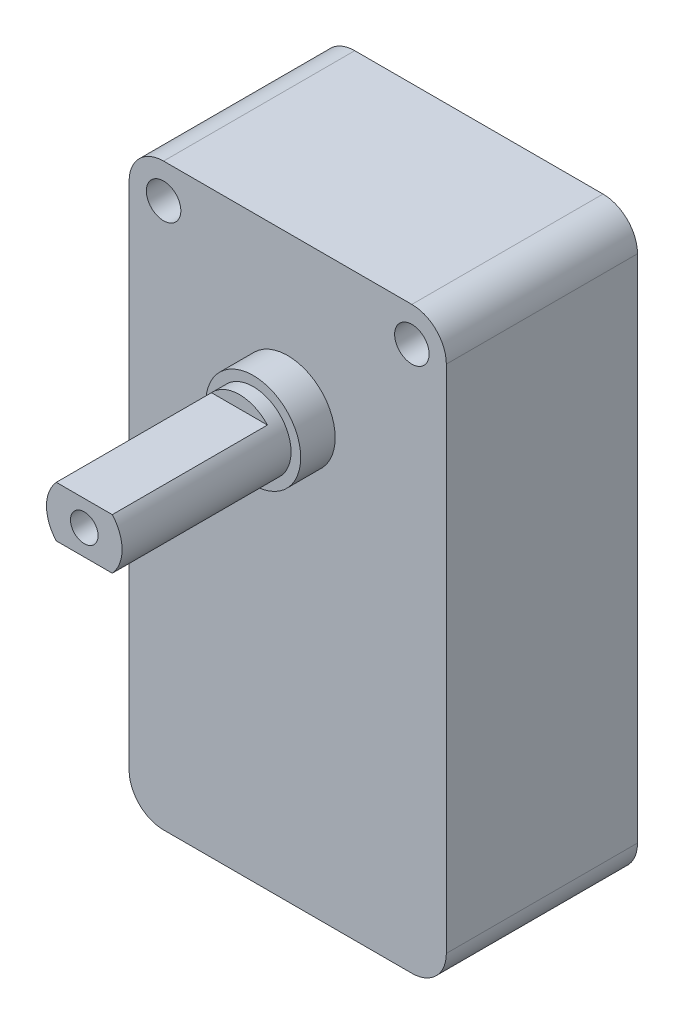
ISO-10303-21;
HEADER;
FILE_DESCRIPTION(('STEP AP214'),'2;1');
FILE_NAME('part.step','',(''),(''),'','','');
FILE_SCHEMA(('AUTOMOTIVE_DESIGN { 1 0 10303 214 1 1 1 1 }'));
ENDSEC;
DATA;
#1=APPLICATION_CONTEXT('core data for automotive mechanical design processes');
#2=APPLICATION_PROTOCOL_DEFINITION('international standard','automotive_design',2000,#1);
#3=PRODUCT_CONTEXT('',#1,'mechanical');
#4=PRODUCT('Part','Part','',(#3));
#5=PRODUCT_RELATED_PRODUCT_CATEGORY('part','',(#4));
#6=PRODUCT_DEFINITION_FORMATION('','',#4);
#7=PRODUCT_DEFINITION_CONTEXT('part definition',#1,'design');
#8=PRODUCT_DEFINITION('design','',#6,#7);
#9=PRODUCT_DEFINITION_SHAPE('','',#8);
#10=(LENGTH_UNIT() NAMED_UNIT(*) SI_UNIT(.MILLI.,.METRE.));
#11=(NAMED_UNIT(*) PLANE_ANGLE_UNIT() SI_UNIT($,.RADIAN.));
#12=(NAMED_UNIT(*) SI_UNIT($,.STERADIAN.) SOLID_ANGLE_UNIT());
#13=UNCERTAINTY_MEASURE_WITH_UNIT(LENGTH_MEASURE(1.E-05),#10,'distance_accuracy_value','');
#14=(GEOMETRIC_REPRESENTATION_CONTEXT(3) GLOBAL_UNCERTAINTY_ASSIGNED_CONTEXT((#13)) GLOBAL_UNIT_ASSIGNED_CONTEXT((#10,
#11,#12)) REPRESENTATION_CONTEXT('',''));
#15=CARTESIAN_POINT('',(0.,0.,0.));
#16=DIRECTION('',(0.,0.,1.));
#17=DIRECTION('',(1.,0.,0.));
#18=AXIS2_PLACEMENT_3D('',#15,#16,#17);
#19=CARTESIAN_POINT('',(0.,0.,3.5));
#20=DIRECTION('',(0.,0.,1.));
#21=DIRECTION('',(1.,0.,0.));
#22=AXIS2_PLACEMENT_3D('',#19,#20,#21);
#23=PLANE('',#22);
#24=CARTESIAN_POINT('',(0.,0.,3.5));
#25=DIRECTION('',(0.,0.,1.));
#26=DIRECTION('',(1.,0.,0.));
#27=AXIS2_PLACEMENT_3D('',#24,#25,#26);
#28=CIRCLE('',#27,2.74);
#29=CARTESIAN_POINT('',(2.03027091788265,1.84,3.5));
#30=VERTEX_POINT('',#29);
#31=CARTESIAN_POINT('',(-2.03027091788264,1.84,3.5));
#32=VERTEX_POINT('',#31);
#33=EDGE_CURVE('E173',#30,#32,#28,.T.);
#34=ORIENTED_EDGE('',*,*,#33,.T.);
#35=DIRECTION('',(1.,0.,0.));
#36=VECTOR('',#35,1.);
#37=CARTESIAN_POINT('',(0.,1.84,3.5));
#38=LINE('',#37,#36);
#39=EDGE_CURVE('E12',#32,#30,#38,.T.);
#40=ORIENTED_EDGE('',*,*,#39,.T.);
#41=EDGE_LOOP('',(#34,#40));
#42=FACE_BOUND('',#41,.T.);
#43=ADVANCED_FACE('F64',(#42),#23,.T.);
#44=CARTESIAN_POINT('',(-2.03027091788264,-1.84,3.5));
#45=VERTEX_POINT('',#44);
#46=CARTESIAN_POINT('',(2.03027091788264,-1.83999999999999,3.5));
#47=VERTEX_POINT('',#46);
#48=EDGE_CURVE('E78',#45,#47,#28,.T.);
#49=ORIENTED_EDGE('',*,*,#48,.T.);
#50=DIRECTION('',(-1.,0.,0.));
#51=VECTOR('',#50,1.);
#52=CARTESIAN_POINT('',(0.,-1.84,3.5));
#53=LINE('',#52,#51);
#54=EDGE_CURVE('E72',#47,#45,#53,.T.);
#55=ORIENTED_EDGE('',*,*,#54,.T.);
#56=EDGE_LOOP('',(#49,#55));
#57=FACE_BOUND('',#56,.T.);
#58=ADVANCED_FACE('F273',(#57),#23,.T.);
#59=CARTESIAN_POINT('',(0.,0.,2.5));
#60=DIRECTION('',(0.,0.,1.));
#61=DIRECTION('',(1.,0.,0.));
#62=AXIS2_PLACEMENT_3D('',#59,#60,#61);
#63=PLANE('',#62);
#64=CARTESIAN_POINT('',(0.,0.,2.5));
#65=DIRECTION('',(0.,0.,1.));
#66=DIRECTION('',(1.,0.,0.));
#67=AXIS2_PLACEMENT_3D('',#64,#65,#66);
#68=CIRCLE('',#67,3.44);
#69=CARTESIAN_POINT('',(3.44,0.,2.5));
#70=VERTEX_POINT('',#69);
#71=EDGE_CURVE('E180',#70,#70,#68,.T.);
#72=ORIENTED_EDGE('',*,*,#71,.T.);
#73=EDGE_LOOP('',(#72));
#74=FACE_BOUND('',#73,.T.);
#75=CARTESIAN_POINT('',(0.,0.,2.5));
#76=DIRECTION('',(0.,0.,1.));
#77=DIRECTION('',(1.,0.,0.));
#78=AXIS2_PLACEMENT_3D('',#75,#76,#77);
#79=CIRCLE('',#78,2.74);
#80=CARTESIAN_POINT('',(2.74,0.,2.5));
#81=VERTEX_POINT('',#80);
#82=EDGE_CURVE('E179',#81,#81,#79,.F.);
#83=ORIENTED_EDGE('',*,*,#82,.T.);
#84=EDGE_LOOP('',(#83));
#85=FACE_BOUND('',#84,.T.);
#86=ADVANCED_FACE('F284',(#74,#85),#63,.T.);
#87=CARTESIAN_POINT('',(0.,0.,0.));
#88=DIRECTION('',(0.,0.,1.));
#89=DIRECTION('',(1.,0.,0.));
#90=AXIS2_PLACEMENT_3D('',#87,#88,#89);
#91=PLANE('',#90);
#92=DIRECTION('',(1.,0.,0.));
#93=VECTOR('',#92,1.);
#94=CARTESIAN_POINT('',(0.,11.15,0.));
#95=LINE('',#94,#93);
#96=CARTESIAN_POINT('',(-8.99999999999998,11.15,0.));
#97=VERTEX_POINT('',#96);
#98=CARTESIAN_POINT('',(8.99999999999999,11.15,0.));
#99=VERTEX_POINT('',#98);
#100=EDGE_CURVE('E222',#97,#99,#95,.T.);
#101=ORIENTED_EDGE('',*,*,#100,.F.);
#102=CARTESIAN_POINT('',(-8.99999999999999,8.65,0.));
#103=DIRECTION('',(0.,0.,1.));
#104=DIRECTION('',(1.,0.,0.));
#105=AXIS2_PLACEMENT_3D('',#102,#103,#104);
#106=CIRCLE('',#105,2.5);
#107=CARTESIAN_POINT('',(-11.5,8.64999999999998,0.));
#108=VERTEX_POINT('',#107);
#109=EDGE_CURVE('E225',#97,#108,#106,.T.);
#110=ORIENTED_EDGE('',*,*,#109,.T.);
#111=DIRECTION('',(0.,-1.,0.));
#112=VECTOR('',#111,1.);
#113=CARTESIAN_POINT('',(-11.5,0.,0.));
#114=LINE('',#113,#112);
#115=CARTESIAN_POINT('',(-11.5,-28.35,0.));
#116=VERTEX_POINT('',#115);
#117=EDGE_CURVE('E228',#108,#116,#114,.T.);
#118=ORIENTED_EDGE('',*,*,#117,.T.);
#119=CARTESIAN_POINT('',(-8.99999999999999,-28.35,0.));
#120=DIRECTION('',(0.,0.,1.));
#121=DIRECTION('',(1.,0.,0.));
#122=AXIS2_PLACEMENT_3D('',#119,#120,#121);
#123=CIRCLE('',#122,2.5);
#124=CARTESIAN_POINT('',(-8.99999999999997,-30.85,0.));
#125=VERTEX_POINT('',#124);
#126=EDGE_CURVE('E231',#116,#125,#123,.T.);
#127=ORIENTED_EDGE('',*,*,#126,.T.);
#128=DIRECTION('',(1.,0.,0.));
#129=VECTOR('',#128,1.);
#130=CARTESIAN_POINT('',(0.,-30.85,0.));
#131=LINE('',#130,#129);
#132=CARTESIAN_POINT('',(8.99999999999999,-30.85,0.));
#133=VERTEX_POINT('',#132);
#134=EDGE_CURVE('E234',#125,#133,#131,.T.);
#135=ORIENTED_EDGE('',*,*,#134,.T.);
#136=CARTESIAN_POINT('',(9.00000000000001,-28.35,0.));
#137=DIRECTION('',(0.,0.,1.));
#138=DIRECTION('',(1.,0.,0.));
#139=AXIS2_PLACEMENT_3D('',#136,#137,#138);
#140=CIRCLE('',#139,2.5);
#141=CARTESIAN_POINT('',(11.5,-28.35,0.));
#142=VERTEX_POINT('',#141);
#143=EDGE_CURVE('E237',#133,#142,#140,.T.);
#144=ORIENTED_EDGE('',*,*,#143,.T.);
#145=DIRECTION('',(0.,-1.,0.));
#146=VECTOR('',#145,1.);
#147=CARTESIAN_POINT('',(11.5,0.,0.));
#148=LINE('',#147,#146);
#149=CARTESIAN_POINT('',(11.5,8.64999999999999,0.));
#150=VERTEX_POINT('',#149);
#151=EDGE_CURVE('E240',#150,#142,#148,.T.);
#152=ORIENTED_EDGE('',*,*,#151,.F.);
#153=CARTESIAN_POINT('',(9.00000000000001,8.65,0.));
#154=DIRECTION('',(0.,0.,1.));
#155=DIRECTION('',(1.,0.,0.));
#156=AXIS2_PLACEMENT_3D('',#153,#154,#155);
#157=CIRCLE('',#156,2.5);
#158=EDGE_CURVE('E191',#99,#150,#157,.F.);
#159=ORIENTED_EDGE('',*,*,#158,.F.);
#160=EDGE_LOOP('',(#101,#110,#118,#127,#135,#144,#152,#159));
#161=FACE_BOUND('',#160,.T.);
#162=CARTESIAN_POINT('',(-8.99999999999999,8.65,0.));
#163=DIRECTION('',(0.,0.,1.));
#164=DIRECTION('',(1.,0.,0.));
#165=AXIS2_PLACEMENT_3D('',#162,#163,#164);
#166=CIRCLE('',#165,1.25);
#167=CARTESIAN_POINT('',(-7.74999999999999,8.65,0.));
#168=VERTEX_POINT('',#167);
#169=EDGE_CURVE('E219',#168,#168,#166,.T.);
#170=ORIENTED_EDGE('',*,*,#169,.F.);
#171=EDGE_LOOP('',(#170));
#172=FACE_BOUND('',#171,.T.);
#173=CARTESIAN_POINT('',(9.00000000000001,8.65,0.));
#174=DIRECTION('',(0.,0.,1.));
#175=DIRECTION('',(1.,0.,0.));
#176=AXIS2_PLACEMENT_3D('',#173,#174,#175);
#177=CIRCLE('',#176,1.25);
#178=CARTESIAN_POINT('',(10.25,8.65,0.));
#179=VERTEX_POINT('',#178);
#180=EDGE_CURVE('E183',#179,#179,#177,.T.);
#181=ORIENTED_EDGE('',*,*,#180,.F.);
#182=EDGE_LOOP('',(#181));
#183=FACE_BOUND('',#182,.T.);
#184=CARTESIAN_POINT('',(0.,0.,0.));
#185=DIRECTION('',(0.,0.,1.));
#186=DIRECTION('',(1.,0.,0.));
#187=AXIS2_PLACEMENT_3D('',#184,#185,#186);
#188=CIRCLE('',#187,3.44);
#189=CARTESIAN_POINT('',(3.44,0.,0.));
#190=VERTEX_POINT('',#189);
#191=EDGE_CURVE('E184',#190,#190,#188,.T.);
#192=ORIENTED_EDGE('',*,*,#191,.F.);
#193=EDGE_LOOP('',(#192));
#194=FACE_BOUND('',#193,.T.);
#195=ADVANCED_FACE('F288',(#161,#172,#183,#194),#91,.T.);
#196=CARTESIAN_POINT('',(0.,11.15,-13.86));
#197=DIRECTION('',(0.,-1.,0.));
#198=DIRECTION('',(1.,0.,0.));
#199=AXIS2_PLACEMENT_3D('',#196,#197,#198);
#200=PLANE('',#199);
#201=ORIENTED_EDGE('',*,*,#100,.T.);
#202=DIRECTION('',(0.,0.,1.));
#203=VECTOR('',#202,1.);
#204=CARTESIAN_POINT('',(8.99999999999999,11.15,-13.86));
#205=LINE('',#204,#203);
#206=CARTESIAN_POINT('',(8.99999999999999,11.15,-13.86));
#207=VERTEX_POINT('',#206);
#208=EDGE_CURVE('E244',#207,#99,#205,.T.);
#209=ORIENTED_EDGE('',*,*,#208,.F.);
#210=DIRECTION('',(1.,0.,0.));
#211=VECTOR('',#210,1.);
#212=CARTESIAN_POINT('',(0.,11.15,-13.86));
#213=LINE('',#212,#211);
#214=CARTESIAN_POINT('',(-8.99999999999998,11.15,-13.86));
#215=VERTEX_POINT('',#214);
#216=EDGE_CURVE('E194',#215,#207,#213,.T.);
#217=ORIENTED_EDGE('',*,*,#216,.F.);
#218=DIRECTION('',(0.,0.,1.));
#219=VECTOR('',#218,1.);
#220=CARTESIAN_POINT('',(-8.99999999999998,11.15,-13.86));
#221=LINE('',#220,#219);
#222=EDGE_CURVE('E216',#215,#97,#221,.T.);
#223=ORIENTED_EDGE('',*,*,#222,.T.);
#224=EDGE_LOOP('',(#201,#209,#217,#223));
#225=FACE_BOUND('',#224,.T.);
#226=ADVANCED_FACE('F294',(#225),#200,.F.);
#227=CARTESIAN_POINT('',(9.00000000000001,8.65,-13.86));
#228=DIRECTION('',(0.,0.,1.));
#229=DIRECTION('',(1.,0.,0.));
#230=AXIS2_PLACEMENT_3D('',#227,#228,#229);
#231=CYLINDRICAL_SURFACE('',#230,2.5);
#232=ORIENTED_EDGE('',*,*,#158,.T.);
#233=DIRECTION('',(0.,0.,1.));
#234=VECTOR('',#233,1.);
#235=CARTESIAN_POINT('',(11.5,8.64999999999999,-13.86));
#236=LINE('',#235,#234);
#237=CARTESIAN_POINT('',(11.5,8.64999999999999,-13.86));
#238=VERTEX_POINT('',#237);
#239=EDGE_CURVE('E248',#238,#150,#236,.T.);
#240=ORIENTED_EDGE('',*,*,#239,.F.);
#241=CARTESIAN_POINT('',(9.00000000000001,8.65,-13.86));
#242=DIRECTION('',(0.,0.,1.));
#243=DIRECTION('',(1.,0.,0.));
#244=AXIS2_PLACEMENT_3D('',#241,#242,#243);
#245=CIRCLE('',#244,2.5);
#246=EDGE_CURVE('E214',#207,#238,#245,.F.);
#247=ORIENTED_EDGE('',*,*,#246,.F.);
#248=ORIENTED_EDGE('',*,*,#208,.T.);
#249=EDGE_LOOP('',(#232,#240,#247,#248));
#250=FACE_BOUND('',#249,.T.);
#251=ADVANCED_FACE('F308',(#250),#231,.T.);
#252=CARTESIAN_POINT('',(11.5,0.,-13.86));
#253=DIRECTION('',(-1.,0.,0.));
#254=DIRECTION('',(0.,-1.,0.));
#255=AXIS2_PLACEMENT_3D('',#252,#253,#254);
#256=PLANE('',#255);
#257=ORIENTED_EDGE('',*,*,#151,.T.);
#258=DIRECTION('',(0.,0.,1.));
#259=VECTOR('',#258,1.);
#260=CARTESIAN_POINT('',(11.5,-28.35,-13.86));
#261=LINE('',#260,#259);
#262=CARTESIAN_POINT('',(11.5,-28.35,-13.86));
#263=VERTEX_POINT('',#262);
#264=EDGE_CURVE('E251',#263,#142,#261,.T.);
#265=ORIENTED_EDGE('',*,*,#264,.F.);
#266=DIRECTION('',(0.,-1.,0.));
#267=VECTOR('',#266,1.);
#268=CARTESIAN_POINT('',(11.5,0.,-13.86));
#269=LINE('',#268,#267);
#270=EDGE_CURVE('E212',#238,#263,#269,.T.);
#271=ORIENTED_EDGE('',*,*,#270,.F.);
#272=ORIENTED_EDGE('',*,*,#239,.T.);
#273=EDGE_LOOP('',(#257,#265,#271,#272));
#274=FACE_BOUND('',#273,.T.);
#275=ADVANCED_FACE('F311',(#274),#256,.F.);
#276=CARTESIAN_POINT('',(9.00000000000001,-28.35,-13.86));
#277=DIRECTION('',(0.,0.,1.));
#278=DIRECTION('',(1.,0.,0.));
#279=AXIS2_PLACEMENT_3D('',#276,#277,#278);
#280=CYLINDRICAL_SURFACE('',#279,2.5);
#281=ORIENTED_EDGE('',*,*,#143,.F.);
#282=DIRECTION('',(0.,0.,1.));
#283=VECTOR('',#282,1.);
#284=CARTESIAN_POINT('',(8.99999999999999,-30.85,-13.86));
#285=LINE('',#284,#283);
#286=CARTESIAN_POINT('',(8.99999999999999,-30.85,-13.86));
#287=VERTEX_POINT('',#286);
#288=EDGE_CURVE('E253',#287,#133,#285,.T.);
#289=ORIENTED_EDGE('',*,*,#288,.F.);
#290=CARTESIAN_POINT('',(9.00000000000001,-28.35,-13.86));
#291=DIRECTION('',(0.,0.,1.));
#292=DIRECTION('',(1.,0.,0.));
#293=AXIS2_PLACEMENT_3D('',#290,#291,#292);
#294=CIRCLE('',#293,2.5);
#295=EDGE_CURVE('E209',#287,#263,#294,.T.);
#296=ORIENTED_EDGE('',*,*,#295,.T.);
#297=ORIENTED_EDGE('',*,*,#264,.T.);
#298=EDGE_LOOP('',(#281,#289,#296,#297));
#299=FACE_BOUND('',#298,.T.);
#300=ADVANCED_FACE('F315',(#299),#280,.T.);
#301=CARTESIAN_POINT('',(0.,-30.85,-13.86));
#302=DIRECTION('',(0.,-1.,0.));
#303=DIRECTION('',(1.,0.,0.));
#304=AXIS2_PLACEMENT_3D('',#301,#302,#303);
#305=PLANE('',#304);
#306=ORIENTED_EDGE('',*,*,#134,.F.);
#307=DIRECTION('',(0.,0.,1.));
#308=VECTOR('',#307,1.);
#309=CARTESIAN_POINT('',(-8.99999999999997,-30.85,-13.86));
#310=LINE('',#309,#308);
#311=CARTESIAN_POINT('',(-8.99999999999997,-30.85,-13.86));
#312=VERTEX_POINT('',#311);
#313=EDGE_CURVE('E255',#312,#125,#310,.T.);
#314=ORIENTED_EDGE('',*,*,#313,.F.);
#315=DIRECTION('',(1.,0.,0.));
#316=VECTOR('',#315,1.);
#317=CARTESIAN_POINT('',(0.,-30.85,-13.86));
#318=LINE('',#317,#316);
#319=EDGE_CURVE('E206',#312,#287,#318,.T.);
#320=ORIENTED_EDGE('',*,*,#319,.T.);
#321=ORIENTED_EDGE('',*,*,#288,.T.);
#322=EDGE_LOOP('',(#306,#314,#320,#321));
#323=FACE_BOUND('',#322,.T.);
#324=ADVANCED_FACE('F319',(#323),#305,.T.);
#325=CARTESIAN_POINT('',(-8.99999999999999,-28.35,-13.86));
#326=DIRECTION('',(0.,0.,1.));
#327=DIRECTION('',(1.,0.,0.));
#328=AXIS2_PLACEMENT_3D('',#325,#326,#327);
#329=CYLINDRICAL_SURFACE('',#328,2.5);
#330=ORIENTED_EDGE('',*,*,#126,.F.);
#331=DIRECTION('',(0.,0.,1.));
#332=VECTOR('',#331,1.);
#333=CARTESIAN_POINT('',(-11.5,-28.35,-13.86));
#334=LINE('',#333,#332);
#335=CARTESIAN_POINT('',(-11.5,-28.35,-13.86));
#336=VERTEX_POINT('',#335);
#337=EDGE_CURVE('E257',#336,#116,#334,.T.);
#338=ORIENTED_EDGE('',*,*,#337,.F.);
#339=CARTESIAN_POINT('',(-8.99999999999999,-28.35,-13.86));
#340=DIRECTION('',(0.,0.,1.));
#341=DIRECTION('',(1.,0.,0.));
#342=AXIS2_PLACEMENT_3D('',#339,#340,#341);
#343=CIRCLE('',#342,2.5);
#344=EDGE_CURVE('E203',#336,#312,#343,.T.);
#345=ORIENTED_EDGE('',*,*,#344,.T.);
#346=ORIENTED_EDGE('',*,*,#313,.T.);
#347=EDGE_LOOP('',(#330,#338,#345,#346));
#348=FACE_BOUND('',#347,.T.);
#349=ADVANCED_FACE('F323',(#348),#329,.T.);
#350=CARTESIAN_POINT('',(-11.5,0.,-13.86));
#351=DIRECTION('',(-1.,0.,0.));
#352=DIRECTION('',(0.,-1.,0.));
#353=AXIS2_PLACEMENT_3D('',#350,#351,#352);
#354=PLANE('',#353);
#355=ORIENTED_EDGE('',*,*,#117,.F.);
#356=DIRECTION('',(0.,0.,1.));
#357=VECTOR('',#356,1.);
#358=CARTESIAN_POINT('',(-11.5,8.64999999999998,-13.86));
#359=LINE('',#358,#357);
#360=CARTESIAN_POINT('',(-11.5,8.64999999999998,-13.86));
#361=VERTEX_POINT('',#360);
#362=EDGE_CURVE('E259',#361,#108,#359,.T.);
#363=ORIENTED_EDGE('',*,*,#362,.F.);
#364=DIRECTION('',(0.,-1.,0.));
#365=VECTOR('',#364,1.);
#366=CARTESIAN_POINT('',(-11.5,0.,-13.86));
#367=LINE('',#366,#365);
#368=EDGE_CURVE('E200',#361,#336,#367,.T.);
#369=ORIENTED_EDGE('',*,*,#368,.T.);
#370=ORIENTED_EDGE('',*,*,#337,.T.);
#371=EDGE_LOOP('',(#355,#363,#369,#370));
#372=FACE_BOUND('',#371,.T.);
#373=ADVANCED_FACE('F327',(#372),#354,.T.);
#374=CARTESIAN_POINT('',(-8.99999999999999,8.65,-13.86));
#375=DIRECTION('',(0.,0.,1.));
#376=DIRECTION('',(1.,0.,0.));
#377=AXIS2_PLACEMENT_3D('',#374,#375,#376);
#378=CYLINDRICAL_SURFACE('',#377,1.25);
#379=CARTESIAN_POINT('',(-8.99999999999999,8.65,-13.86));
#380=DIRECTION('',(0.,0.,1.));
#381=DIRECTION('',(1.,0.,0.));
#382=AXIS2_PLACEMENT_3D('',#379,#380,#381);
#383=CIRCLE('',#382,1.25);
#384=CARTESIAN_POINT('',(-7.74999999999999,8.65,-13.86));
#385=VERTEX_POINT('',#384);
#386=EDGE_CURVE('E190',#385,#385,#383,.T.);
#387=CARTESIAN_POINT('',(-7.74999999999999,8.65,-13.86));
#388=CARTESIAN_POINT('',(-7.74999999999999,8.65,-13.715625));
#389=CARTESIAN_POINT('',(-7.74999999999999,8.65,-13.57125));
#390=CARTESIAN_POINT('',(-7.74999999999999,8.65,-13.2825));
#391=CARTESIAN_POINT('',(-7.74999999999999,8.65,-13.138125));
#392=CARTESIAN_POINT('',(-7.74999999999999,8.65,-12.849375));
#393=CARTESIAN_POINT('',(-7.74999999999999,8.65,-12.705));
#394=CARTESIAN_POINT('',(-7.74999999999999,8.65,-12.41625));
#395=CARTESIAN_POINT('',(-7.74999999999999,8.65,-12.271875));
#396=CARTESIAN_POINT('',(-7.74999999999999,8.65,-11.983125));
#397=CARTESIAN_POINT('',(-7.74999999999999,8.65,-11.83875));
#398=CARTESIAN_POINT('',(-7.74999999999999,8.65,-11.55));
#399=CARTESIAN_POINT('',(-7.74999999999999,8.65,-11.405625));
#400=CARTESIAN_POINT('',(-7.74999999999999,8.65,-11.116875));
#401=CARTESIAN_POINT('',(-7.74999999999999,8.65,-10.9725));
#402=CARTESIAN_POINT('',(-7.74999999999999,8.65,-10.68375));
#403=CARTESIAN_POINT('',(-7.74999999999999,8.65,-10.539375));
#404=CARTESIAN_POINT('',(-7.74999999999999,8.65,-10.250625));
#405=CARTESIAN_POINT('',(-7.74999999999999,8.65,-10.10625));
#406=CARTESIAN_POINT('',(-7.74999999999999,8.65,-9.8175));
#407=CARTESIAN_POINT('',(-7.74999999999999,8.65,-9.673125));
#408=CARTESIAN_POINT('',(-7.74999999999999,8.65,-9.384375));
#409=CARTESIAN_POINT('',(-7.74999999999999,8.65,-9.24));
#410=CARTESIAN_POINT('',(-7.74999999999999,8.65,-8.95125));
#411=CARTESIAN_POINT('',(-7.74999999999999,8.65,-8.806875));
#412=CARTESIAN_POINT('',(-7.74999999999999,8.65,-8.518125));
#413=CARTESIAN_POINT('',(-7.74999999999999,8.65,-8.37375));
#414=CARTESIAN_POINT('',(-7.74999999999999,8.65,-8.085));
#415=CARTESIAN_POINT('',(-7.74999999999999,8.65,-7.940625));
#416=CARTESIAN_POINT('',(-7.74999999999999,8.65,-7.651875));
#417=CARTESIAN_POINT('',(-7.74999999999999,8.65,-7.5075));
#418=CARTESIAN_POINT('',(-7.74999999999999,8.65,-7.21875));
#419=CARTESIAN_POINT('',(-7.74999999999999,8.65,-7.074375));
#420=CARTESIAN_POINT('',(-7.74999999999999,8.65,-6.785625));
#421=CARTESIAN_POINT('',(-7.74999999999999,8.65,-6.64125));
#422=CARTESIAN_POINT('',(-7.74999999999999,8.65,-6.3525));
#423=CARTESIAN_POINT('',(-7.74999999999999,8.65,-6.208125));
#424=CARTESIAN_POINT('',(-7.74999999999999,8.65,-5.919375));
#425=CARTESIAN_POINT('',(-7.74999999999999,8.65,-5.775));
#426=CARTESIAN_POINT('',(-7.74999999999999,8.65,-5.48625));
#427=CARTESIAN_POINT('',(-7.74999999999999,8.65,-5.341875));
#428=CARTESIAN_POINT('',(-7.74999999999999,8.65,-5.053125));
#429=CARTESIAN_POINT('',(-7.74999999999999,8.65,-4.90875));
#430=CARTESIAN_POINT('',(-7.74999999999999,8.65,-4.62));
#431=CARTESIAN_POINT('',(-7.74999999999999,8.65,-4.475625));
#432=CARTESIAN_POINT('',(-7.74999999999999,8.65,-4.186875));
#433=CARTESIAN_POINT('',(-7.74999999999999,8.65,-4.0425));
#434=CARTESIAN_POINT('',(-7.74999999999999,8.65,-3.75375));
#435=CARTESIAN_POINT('',(-7.74999999999999,8.65,-3.609375));
#436=CARTESIAN_POINT('',(-7.74999999999999,8.65,-3.320625));
#437=CARTESIAN_POINT('',(-7.74999999999999,8.65,-3.17625));
#438=CARTESIAN_POINT('',(-7.74999999999999,8.65,-2.8875));
#439=CARTESIAN_POINT('',(-7.74999999999999,8.65,-2.743125));
#440=CARTESIAN_POINT('',(-7.74999999999999,8.65,-2.454375));
#441=CARTESIAN_POINT('',(-7.74999999999999,8.65,-2.31));
#442=CARTESIAN_POINT('',(-7.74999999999999,8.65,-2.02125));
#443=CARTESIAN_POINT('',(-7.74999999999999,8.65,-1.876875));
#444=CARTESIAN_POINT('',(-7.74999999999999,8.65,-1.588125));
#445=CARTESIAN_POINT('',(-7.74999999999999,8.65,-1.44375));
#446=CARTESIAN_POINT('',(-7.74999999999999,8.65,-1.155));
#447=CARTESIAN_POINT('',(-7.74999999999999,8.65,-1.010625));
#448=CARTESIAN_POINT('',(-7.74999999999999,8.65,-0.721875));
#449=CARTESIAN_POINT('',(-7.74999999999999,8.65,-0.5775));
#450=CARTESIAN_POINT('',(-7.74999999999999,8.65,-0.28875));
#451=CARTESIAN_POINT('',(-7.74999999999999,8.65,-0.144375));
#452=CARTESIAN_POINT('',(-7.74999999999999,8.65,0.));
#453=B_SPLINE_CURVE_WITH_KNOTS('',3,(#387,#388,#389,#390,#391,#392,#393,#394,#395,#396,#397,
#398,#399,#400,#401,#402,#403,#404,#405,#406,#407,#408,#409,#410,#411,#412,#413,#414,#415,#416,
#417,#418,#419,#420,#421,#422,#423,#424,#425,#426,#427,#428,#429,#430,#431,#432,#433,#434,#435,
#436,#437,#438,#439,#440,#441,#442,#443,#444,#445,#446,#447,#448,#449,#450,#451,#452),
.UNSPECIFIED.,.F.,.F.,(4,2,2,2,2,2,2,2,2,2,2,2,2,2,2,2,2,2,2,2,2,2,2,2,2,2,2,2,2,2,2,2,4),(0.,
0.433124999999999,0.866249999999999,1.299375,1.7325,2.165625,2.59875,3.031875,3.465,3.898125,
4.33125,4.764375,5.1975,5.630625,6.06375,6.496875,6.93,7.363125,7.79625,8.229375,8.6625,
9.095625,9.52875,9.961875,10.395,10.828125,11.26125,11.694375,12.1275,12.560625,12.99375,
13.426875,13.86),.UNSPECIFIED.);
#454=EDGE_CURVE('BSEAM331',#385,#168,#453,.T.);
#455=ORIENTED_EDGE('',*,*,#386,.F.);
#456=ORIENTED_EDGE('',*,*,#169,.T.);
#457=ORIENTED_EDGE('',*,*,#454,.T.);
#458=ORIENTED_EDGE('',*,*,#454,.F.);
#459=EDGE_LOOP('',(#455,#457,#456,#458));
#460=FACE_BOUND('',#459,.T.);
#461=ADVANCED_FACE('F331',(#460),#378,.F.);
#462=CARTESIAN_POINT('',(9.00000000000001,8.65,-13.86));
#463=DIRECTION('',(0.,0.,1.));
#464=DIRECTION('',(1.,0.,0.));
#465=AXIS2_PLACEMENT_3D('',#462,#463,#464);
#466=CYLINDRICAL_SURFACE('',#465,1.25);
#467=CARTESIAN_POINT('',(9.00000000000001,8.65,-13.86));
#468=DIRECTION('',(0.,0.,1.));
#469=DIRECTION('',(1.,0.,0.));
#470=AXIS2_PLACEMENT_3D('',#467,#468,#469);
#471=CIRCLE('',#470,1.25);
#472=CARTESIAN_POINT('',(10.25,8.65,-13.86));
#473=VERTEX_POINT('',#472);
#474=EDGE_CURVE('E187',#473,#473,#471,.T.);
#475=CARTESIAN_POINT('',(10.25,8.65,-13.86));
#476=CARTESIAN_POINT('',(10.25,8.65,-13.715625));
#477=CARTESIAN_POINT('',(10.25,8.65,-13.57125));
#478=CARTESIAN_POINT('',(10.25,8.65,-13.2825));
#479=CARTESIAN_POINT('',(10.25,8.65,-13.138125));
#480=CARTESIAN_POINT('',(10.25,8.65,-12.849375));
#481=CARTESIAN_POINT('',(10.25,8.65,-12.705));
#482=CARTESIAN_POINT('',(10.25,8.65,-12.41625));
#483=CARTESIAN_POINT('',(10.25,8.65,-12.271875));
#484=CARTESIAN_POINT('',(10.25,8.65,-11.983125));
#485=CARTESIAN_POINT('',(10.25,8.65,-11.83875));
#486=CARTESIAN_POINT('',(10.25,8.65,-11.55));
#487=CARTESIAN_POINT('',(10.25,8.65,-11.405625));
#488=CARTESIAN_POINT('',(10.25,8.65,-11.116875));
#489=CARTESIAN_POINT('',(10.25,8.65,-10.9725));
#490=CARTESIAN_POINT('',(10.25,8.65,-10.68375));
#491=CARTESIAN_POINT('',(10.25,8.65,-10.539375));
#492=CARTESIAN_POINT('',(10.25,8.65,-10.250625));
#493=CARTESIAN_POINT('',(10.25,8.65,-10.10625));
#494=CARTESIAN_POINT('',(10.25,8.65,-9.8175));
#495=CARTESIAN_POINT('',(10.25,8.65,-9.673125));
#496=CARTESIAN_POINT('',(10.25,8.65,-9.384375));
#497=CARTESIAN_POINT('',(10.25,8.65,-9.24));
#498=CARTESIAN_POINT('',(10.25,8.65,-8.95125));
#499=CARTESIAN_POINT('',(10.25,8.65,-8.806875));
#500=CARTESIAN_POINT('',(10.25,8.65,-8.518125));
#501=CARTESIAN_POINT('',(10.25,8.65,-8.37375));
#502=CARTESIAN_POINT('',(10.25,8.65,-8.085));
#503=CARTESIAN_POINT('',(10.25,8.65,-7.940625));
#504=CARTESIAN_POINT('',(10.25,8.65,-7.651875));
#505=CARTESIAN_POINT('',(10.25,8.65,-7.5075));
#506=CARTESIAN_POINT('',(10.25,8.65,-7.21875));
#507=CARTESIAN_POINT('',(10.25,8.65,-7.074375));
#508=CARTESIAN_POINT('',(10.25,8.65,-6.785625));
#509=CARTESIAN_POINT('',(10.25,8.65,-6.64125));
#510=CARTESIAN_POINT('',(10.25,8.65,-6.3525));
#511=CARTESIAN_POINT('',(10.25,8.65,-6.208125));
#512=CARTESIAN_POINT('',(10.25,8.65,-5.919375));
#513=CARTESIAN_POINT('',(10.25,8.65,-5.775));
#514=CARTESIAN_POINT('',(10.25,8.65,-5.48625));
#515=CARTESIAN_POINT('',(10.25,8.65,-5.341875));
#516=CARTESIAN_POINT('',(10.25,8.65,-5.053125));
#517=CARTESIAN_POINT('',(10.25,8.65,-4.90875));
#518=CARTESIAN_POINT('',(10.25,8.65,-4.62));
#519=CARTESIAN_POINT('',(10.25,8.65,-4.475625));
#520=CARTESIAN_POINT('',(10.25,8.65,-4.186875));
#521=CARTESIAN_POINT('',(10.25,8.65,-4.0425));
#522=CARTESIAN_POINT('',(10.25,8.65,-3.75375));
#523=CARTESIAN_POINT('',(10.25,8.65,-3.609375));
#524=CARTESIAN_POINT('',(10.25,8.65,-3.320625));
#525=CARTESIAN_POINT('',(10.25,8.65,-3.17625));
#526=CARTESIAN_POINT('',(10.25,8.65,-2.8875));
#527=CARTESIAN_POINT('',(10.25,8.65,-2.743125));
#528=CARTESIAN_POINT('',(10.25,8.65,-2.454375));
#529=CARTESIAN_POINT('',(10.25,8.65,-2.31));
#530=CARTESIAN_POINT('',(10.25,8.65,-2.02125));
#531=CARTESIAN_POINT('',(10.25,8.65,-1.876875));
#532=CARTESIAN_POINT('',(10.25,8.65,-1.588125));
#533=CARTESIAN_POINT('',(10.25,8.65,-1.44375));
#534=CARTESIAN_POINT('',(10.25,8.65,-1.155));
#535=CARTESIAN_POINT('',(10.25,8.65,-1.010625));
#536=CARTESIAN_POINT('',(10.25,8.65,-0.721875));
#537=CARTESIAN_POINT('',(10.25,8.65,-0.5775));
#538=CARTESIAN_POINT('',(10.25,8.65,-0.28875));
#539=CARTESIAN_POINT('',(10.25,8.65,-0.144375));
#540=CARTESIAN_POINT('',(10.25,8.65,0.));
#541=B_SPLINE_CURVE_WITH_KNOTS('',3,(#475,#476,#477,#478,#479,#480,#481,#482,#483,#484,#485,
#486,#487,#488,#489,#490,#491,#492,#493,#494,#495,#496,#497,#498,#499,#500,#501,#502,#503,#504,
#505,#506,#507,#508,#509,#510,#511,#512,#513,#514,#515,#516,#517,#518,#519,#520,#521,#522,#523,
#524,#525,#526,#527,#528,#529,#530,#531,#532,#533,#534,#535,#536,#537,#538,#539,#540),
.UNSPECIFIED.,.F.,.F.,(4,2,2,2,2,2,2,2,2,2,2,2,2,2,2,2,2,2,2,2,2,2,2,2,2,2,2,2,2,2,2,2,4),(0.,
0.433124999999999,0.866249999999999,1.299375,1.7325,2.165625,2.59875,3.031875,3.465,3.898125,
4.33125,4.764375,5.1975,5.630625,6.06375,6.496875,6.93,7.363125,7.79625,8.229375,8.6625,
9.095625,9.52875,9.961875,10.395,10.828125,11.26125,11.694375,12.1275,12.560625,12.99375,
13.426875,13.86),.UNSPECIFIED.);
#542=EDGE_CURVE('BSEAM66',#473,#179,#541,.T.);
#543=ORIENTED_EDGE('',*,*,#474,.F.);
#544=ORIENTED_EDGE('',*,*,#180,.T.);
#545=ORIENTED_EDGE('',*,*,#542,.T.);
#546=ORIENTED_EDGE('',*,*,#542,.F.);
#547=EDGE_LOOP('',(#543,#545,#544,#546));
#548=FACE_BOUND('',#547,.T.);
#549=ADVANCED_FACE('F66',(#548),#466,.F.);
#550=CARTESIAN_POINT('',(-8.99999999999999,8.65,-13.86));
#551=DIRECTION('',(0.,0.,1.));
#552=DIRECTION('',(1.,0.,0.));
#553=AXIS2_PLACEMENT_3D('',#550,#551,#552);
#554=CYLINDRICAL_SURFACE('',#553,2.5);
#555=ORIENTED_EDGE('',*,*,#109,.F.);
#556=ORIENTED_EDGE('',*,*,#222,.F.);
#557=CARTESIAN_POINT('',(-8.99999999999999,8.65,-13.86));
#558=DIRECTION('',(0.,0.,1.));
#559=DIRECTION('',(1.,0.,0.));
#560=AXIS2_PLACEMENT_3D('',#557,#558,#559);
#561=CIRCLE('',#560,2.5);
#562=EDGE_CURVE('E197',#215,#361,#561,.T.);
#563=ORIENTED_EDGE('',*,*,#562,.T.);
#564=ORIENTED_EDGE('',*,*,#362,.T.);
#565=EDGE_LOOP('',(#555,#556,#563,#564));
#566=FACE_BOUND('',#565,.T.);
#567=ADVANCED_FACE('F305',(#566),#554,.T.);
#568=CARTESIAN_POINT('',(0.,0.,-13.86));
#569=DIRECTION('',(0.,0.,1.));
#570=DIRECTION('',(1.,0.,0.));
#571=AXIS2_PLACEMENT_3D('',#568,#569,#570);
#572=PLANE('',#571);
#573=ORIENTED_EDGE('',*,*,#474,.T.);
#574=EDGE_LOOP('',(#573));
#575=FACE_BOUND('',#574,.T.);
#576=ORIENTED_EDGE('',*,*,#386,.T.);
#577=EDGE_LOOP('',(#576));
#578=FACE_BOUND('',#577,.T.);
#579=ORIENTED_EDGE('',*,*,#216,.T.);
#580=ORIENTED_EDGE('',*,*,#246,.T.);
#581=ORIENTED_EDGE('',*,*,#270,.T.);
#582=ORIENTED_EDGE('',*,*,#295,.F.);
#583=ORIENTED_EDGE('',*,*,#319,.F.);
#584=ORIENTED_EDGE('',*,*,#344,.F.);
#585=ORIENTED_EDGE('',*,*,#368,.F.);
#586=ORIENTED_EDGE('',*,*,#562,.F.);
#587=EDGE_LOOP('',(#579,#580,#581,#582,#583,#584,#585,#586));
#588=FACE_BOUND('',#587,.T.);
#589=ADVANCED_FACE('F302',(#575,#578,#588),#572,.F.);
#590=CARTESIAN_POINT('',(0.,0.,2.5));
#591=DIRECTION('',(0.,0.,-1.));
#592=DIRECTION('',(-1.,0.,0.));
#593=AXIS2_PLACEMENT_3D('',#590,#591,#592);
#594=CYLINDRICAL_SURFACE('',#593,3.44);
#595=ORIENTED_EDGE('',*,*,#71,.F.);
#596=EDGE_LOOP('',(#595));
#597=FACE_BOUND('',#596,.T.);
#598=ORIENTED_EDGE('',*,*,#191,.T.);
#599=EDGE_LOOP('',(#598));
#600=FACE_BOUND('',#599,.T.);
#601=ADVANCED_FACE('F299',(#597,#600),#594,.T.);
#602=CARTESIAN_POINT('',(0.,0.,3.5));
#603=DIRECTION('',(0.,0.,-1.));
#604=DIRECTION('',(-1.,0.,0.));
#605=AXIS2_PLACEMENT_3D('',#602,#603,#604);
#606=CYLINDRICAL_SURFACE('',#605,2.74);
#607=ORIENTED_EDGE('',*,*,#82,.F.);
#608=EDGE_LOOP('',(#607));
#609=FACE_BOUND('',#608,.T.);
#610=DIRECTION('',(0.,0.,-1.));
#611=VECTOR('',#610,1.);
#612=CARTESIAN_POINT('',(-2.03027091788264,1.84,14.75));
#613=LINE('',#612,#611);
#614=CARTESIAN_POINT('',(-2.03027091788264,1.84,14.75));
#615=VERTEX_POINT('',#614);
#616=EDGE_CURVE('E153',#615,#32,#613,.T.);
#617=ORIENTED_EDGE('',*,*,#616,.T.);
#618=ORIENTED_EDGE('',*,*,#33,.F.);
#619=DIRECTION('',(0.,0.,-1.));
#620=VECTOR('',#619,1.);
#621=CARTESIAN_POINT('',(2.03027091788265,1.84,14.75));
#622=LINE('',#621,#620);
#623=CARTESIAN_POINT('',(2.03027091788265,1.84,14.75));
#624=VERTEX_POINT('',#623);
#625=EDGE_CURVE('E515',#624,#30,#622,.T.);
#626=ORIENTED_EDGE('',*,*,#625,.F.);
#627=CARTESIAN_POINT('',(0.,0.,14.75));
#628=DIRECTION('',(0.,0.,1.));
#629=DIRECTION('',(1.,0.,0.));
#630=AXIS2_PLACEMENT_3D('',#627,#628,#629);
#631=CIRCLE('',#630,2.74);
#632=CARTESIAN_POINT('',(2.03027091788265,-1.84,14.75));
#633=VERTEX_POINT('',#632);
#634=EDGE_CURVE('E161',#633,#624,#631,.T.);
#635=ORIENTED_EDGE('',*,*,#634,.F.);
#636=DIRECTION('',(0.,0.,-1.));
#637=VECTOR('',#636,1.);
#638=CARTESIAN_POINT('',(2.03027091788265,-1.84,14.75));
#639=LINE('',#638,#637);
#640=EDGE_CURVE('E175',#633,#47,#639,.T.);
#641=ORIENTED_EDGE('',*,*,#640,.T.);
#642=ORIENTED_EDGE('',*,*,#48,.F.);
#643=DIRECTION('',(0.,0.,-1.));
#644=VECTOR('',#643,1.);
#645=CARTESIAN_POINT('',(-2.03027091788264,-1.84,14.75));
#646=LINE('',#645,#644);
#647=CARTESIAN_POINT('',(-2.03027091788264,-1.84,14.75));
#648=VERTEX_POINT('',#647);
#649=EDGE_CURVE('E155',#648,#45,#646,.T.);
#650=ORIENTED_EDGE('',*,*,#649,.F.);
#651=EDGE_CURVE('E149',#615,#648,#631,.T.);
#652=ORIENTED_EDGE('',*,*,#651,.F.);
#653=EDGE_LOOP('',(#617,#618,#626,#635,#641,#642,#650,#652));
#654=FACE_BOUND('',#653,.T.);
#655=ADVANCED_FACE('F151',(#609,#654),#606,.T.);
#656=CARTESIAN_POINT('',(0.,1.84,14.75));
#657=DIRECTION('',(0.,-1.,0.));
#658=DIRECTION('',(1.,0.,0.));
#659=AXIS2_PLACEMENT_3D('',#656,#657,#658);
#660=PLANE('',#659);
#661=ORIENTED_EDGE('',*,*,#39,.F.);
#662=ORIENTED_EDGE('',*,*,#616,.F.);
#663=DIRECTION('',(-1.,0.,0.));
#664=VECTOR('',#663,1.);
#665=CARTESIAN_POINT('',(0.,1.84,14.75));
#666=LINE('',#665,#664);
#667=EDGE_CURVE('E159',#624,#615,#666,.T.);
#668=ORIENTED_EDGE('',*,*,#667,.F.);
#669=ORIENTED_EDGE('',*,*,#625,.T.);
#670=EDGE_LOOP('',(#661,#662,#668,#669));
#671=FACE_BOUND('',#670,.T.);
#672=ADVANCED_FACE('F171',(#671),#660,.F.);
#673=CARTESIAN_POINT('',(0.,-1.84,14.75));
#674=DIRECTION('',(0.,1.,0.));
#675=DIRECTION('',(-1.,0.,0.));
#676=AXIS2_PLACEMENT_3D('',#673,#674,#675);
#677=PLANE('',#676);
#678=ORIENTED_EDGE('',*,*,#54,.F.);
#679=ORIENTED_EDGE('',*,*,#640,.F.);
#680=DIRECTION('',(1.,0.,0.));
#681=VECTOR('',#680,1.);
#682=CARTESIAN_POINT('',(0.,-1.84,14.75));
#683=LINE('',#682,#681);
#684=EDGE_CURVE('E158',#648,#633,#683,.T.);
#685=ORIENTED_EDGE('',*,*,#684,.F.);
#686=ORIENTED_EDGE('',*,*,#649,.T.);
#687=EDGE_LOOP('',(#678,#679,#685,#686));
#688=FACE_BOUND('',#687,.T.);
#689=ADVANCED_FACE('F402',(#688),#677,.F.);
#690=CARTESIAN_POINT('',(0.,0.,14.75));
#691=DIRECTION('',(0.,0.,-1.));
#692=DIRECTION('',(-1.,0.,0.));
#693=AXIS2_PLACEMENT_3D('',#690,#691,#692);
#694=CYLINDRICAL_SURFACE('',#693,1.);
#695=CARTESIAN_POINT('',(0.,0.,3.5));
#696=DIRECTION('',(0.,0.,1.));
#697=DIRECTION('',(1.,0.,0.));
#698=AXIS2_PLACEMENT_3D('',#695,#696,#697);
#699=CIRCLE('',#698,1.);
#700=CARTESIAN_POINT('',(1.,0.,3.5));
#701=VERTEX_POINT('',#700);
#702=EDGE_CURVE('E247',#701,#701,#699,.F.);
#703=ORIENTED_EDGE('',*,*,#702,.T.);
#704=EDGE_LOOP('',(#703));
#705=FACE_BOUND('',#704,.T.);
#706=CARTESIAN_POINT('',(0.,0.,14.75));
#707=DIRECTION('',(0.,0.,1.));
#708=DIRECTION('',(1.,0.,0.));
#709=AXIS2_PLACEMENT_3D('',#706,#707,#708);
#710=CIRCLE('',#709,1.);
#711=CARTESIAN_POINT('',(1.,0.,14.75));
#712=VERTEX_POINT('',#711);
#713=EDGE_CURVE('E168',#712,#712,#710,.T.);
#714=ORIENTED_EDGE('',*,*,#713,.T.);
#715=EDGE_LOOP('',(#714));
#716=FACE_BOUND('',#715,.T.);
#717=ADVANCED_FACE('F267',(#705,#716),#694,.F.);
#718=CARTESIAN_POINT('',(0.,0.,14.75));
#719=DIRECTION('',(0.,0.,1.));
#720=DIRECTION('',(1.,0.,0.));
#721=AXIS2_PLACEMENT_3D('',#718,#719,#720);
#722=PLANE('',#721);
#723=ORIENTED_EDGE('',*,*,#713,.F.);
#724=EDGE_LOOP('',(#723));
#725=FACE_BOUND('',#724,.T.);
#726=ORIENTED_EDGE('',*,*,#667,.T.);
#727=ORIENTED_EDGE('',*,*,#651,.T.);
#728=ORIENTED_EDGE('',*,*,#684,.T.);
#729=ORIENTED_EDGE('',*,*,#634,.T.);
#730=EDGE_LOOP('',(#726,#727,#728,#729));
#731=FACE_BOUND('',#730,.T.);
#732=ADVANCED_FACE('F163',(#725,#731),#722,.T.);
#733=ORIENTED_EDGE('',*,*,#702,.F.);
#734=EDGE_LOOP('',(#733));
#735=FACE_BOUND('',#734,.T.);
#736=ADVANCED_FACE('F270',(#735),#23,.T.);
#737=CLOSED_SHELL('',(#43,#58,#86,#195,#226,#251,#275,#300,#324,#349,#373,#461,#549,#567,#589,
#601,#655,#672,#689,#717,#732,#736));
#738=MANIFOLD_SOLID_BREP('B2',#737);
#739=ADVANCED_BREP_SHAPE_REPRESENTATION('',(#18,#738),#14);
#740=SHAPE_DEFINITION_REPRESENTATION(#9,#739);
ENDSEC;
END-ISO-10303-21;
